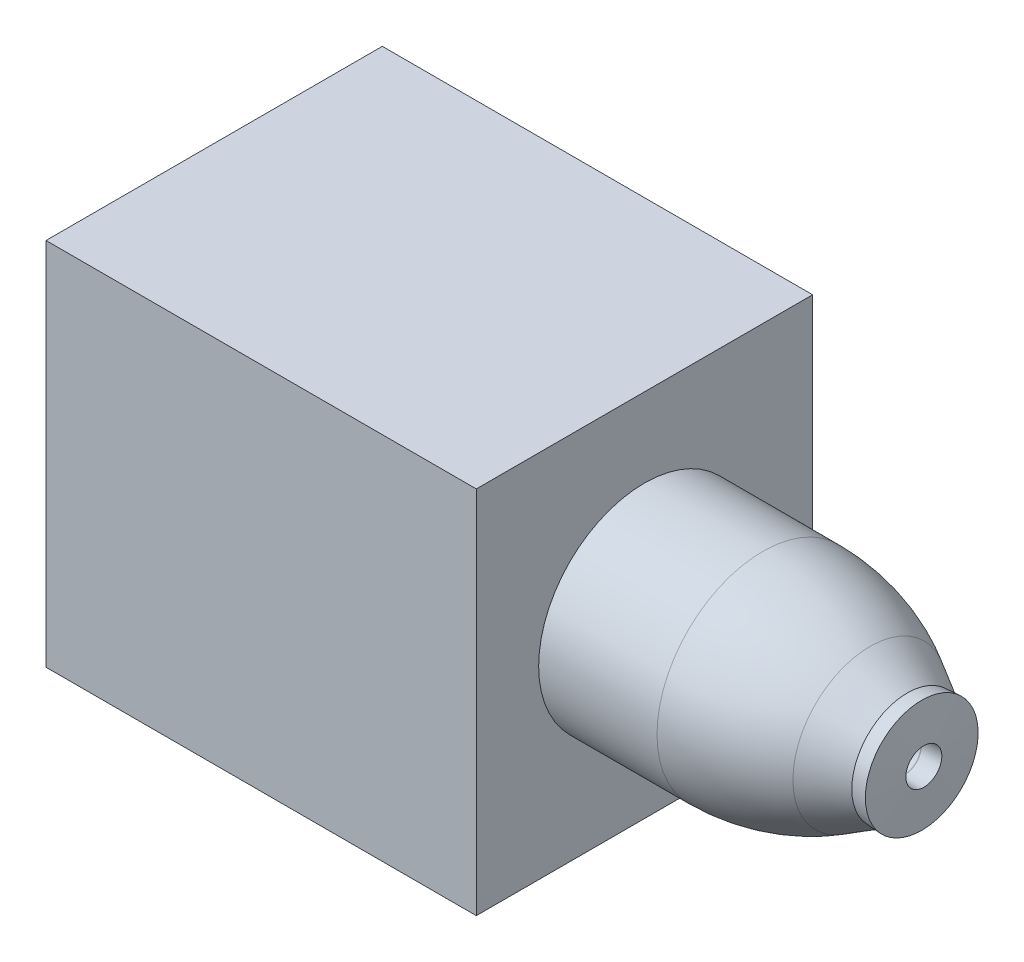
ISO-10303-21;
HEADER;
FILE_DESCRIPTION(('STEP AP214'),'2;1');
FILE_NAME('part.step','',(''),(''),'','','');
FILE_SCHEMA(('AUTOMOTIVE_DESIGN { 1 0 10303 214 1 1 1 1 }'));
ENDSEC;
DATA;
#1=APPLICATION_CONTEXT('core data for automotive mechanical design processes');
#2=APPLICATION_PROTOCOL_DEFINITION('international standard','automotive_design',2000,#1);
#3=PRODUCT_CONTEXT('',#1,'mechanical');
#4=PRODUCT('Part','Part','',(#3));
#5=PRODUCT_RELATED_PRODUCT_CATEGORY('part','',(#4));
#6=PRODUCT_DEFINITION_FORMATION('','',#4);
#7=PRODUCT_DEFINITION_CONTEXT('part definition',#1,'design');
#8=PRODUCT_DEFINITION('design','',#6,#7);
#9=PRODUCT_DEFINITION_SHAPE('','',#8);
#10=(LENGTH_UNIT() NAMED_UNIT(*) SI_UNIT(.MILLI.,.METRE.));
#11=(NAMED_UNIT(*) PLANE_ANGLE_UNIT() SI_UNIT($,.RADIAN.));
#12=(NAMED_UNIT(*) SI_UNIT($,.STERADIAN.) SOLID_ANGLE_UNIT());
#13=UNCERTAINTY_MEASURE_WITH_UNIT(LENGTH_MEASURE(1.E-05),#10,'distance_accuracy_value','');
#14=(GEOMETRIC_REPRESENTATION_CONTEXT(3) GLOBAL_UNCERTAINTY_ASSIGNED_CONTEXT((#13)) GLOBAL_UNIT_ASSIGNED_CONTEXT((#10,
#11,#12)) REPRESENTATION_CONTEXT('',''));
#15=CARTESIAN_POINT('',(0.,0.,0.));
#16=DIRECTION('',(0.,0.,1.));
#17=DIRECTION('',(1.,0.,0.));
#18=AXIS2_PLACEMENT_3D('',#15,#16,#17);
#19=CARTESIAN_POINT('',(0.,0.,0.));
#20=DIRECTION('',(-1.,0.,0.));
#21=DIRECTION('',(0.,0.,1.));
#22=AXIS2_PLACEMENT_3D('',#19,#20,#21);
#23=CYLINDRICAL_SURFACE('',#22,5.593842);
#24=CARTESIAN_POINT('',(58.3117616000078,0.,0.));
#25=DIRECTION('',(-1.,0.,0.));
#26=DIRECTION('',(0.,0.,1.));
#27=AXIS2_PLACEMENT_3D('',#24,#25,#26);
#28=CIRCLE('',#27,5.593842);
#29=CARTESIAN_POINT('',(58.3117616000078,0.,5.593842));
#30=VERTEX_POINT('',#29);
#31=EDGE_CURVE('E179',#30,#30,#28,.T.);
#32=ORIENTED_EDGE('',*,*,#31,.T.);
#33=EDGE_LOOP('',(#32));
#34=FACE_BOUND('',#33,.T.);
#35=CARTESIAN_POINT('',(52.0545881371469,0.,0.));
#36=DIRECTION('',(-1.,0.,0.));
#37=DIRECTION('',(0.,-1.,0.));
#38=AXIS2_PLACEMENT_3D('',#35,#36,#37);
#39=CIRCLE('',#38,5.593842);
#40=CARTESIAN_POINT('',(52.0545881371469,-5.593842,0.));
#41=VERTEX_POINT('',#40);
#42=EDGE_CURVE('E111',#41,#41,#39,.F.);
#43=ORIENTED_EDGE('',*,*,#42,.T.);
#44=EDGE_LOOP('',(#43));
#45=FACE_BOUND('',#44,.T.);
#46=ADVANCED_FACE('F43',(#34,#45),#23,.T.);
#47=CARTESIAN_POINT('',(0.,0.,0.));
#48=DIRECTION('',(-1.,0.,0.));
#49=DIRECTION('',(0.,0.,1.));
#50=AXIS2_PLACEMENT_3D('',#47,#48,#49);
#51=CYLINDRICAL_SURFACE('',#50,3.561842);
#52=CARTESIAN_POINT('',(58.3117616000078,0.,0.));
#53=DIRECTION('',(-1.,0.,0.));
#54=DIRECTION('',(0.,0.,1.));
#55=AXIS2_PLACEMENT_3D('',#52,#53,#54);
#56=CIRCLE('',#55,3.561842);
#57=CARTESIAN_POINT('',(58.3117616000078,0.,3.561842));
#58=VERTEX_POINT('',#57);
#59=EDGE_CURVE('E184',#58,#58,#56,.T.);
#60=ORIENTED_EDGE('',*,*,#59,.F.);
#61=EDGE_LOOP('',(#60));
#62=FACE_BOUND('',#61,.T.);
#63=CARTESIAN_POINT('',(52.0545881371469,0.,0.));
#64=DIRECTION('',(-1.,0.,0.));
#65=DIRECTION('',(0.,-1.,0.));
#66=AXIS2_PLACEMENT_3D('',#63,#64,#65);
#67=CIRCLE('',#66,3.561842);
#68=CARTESIAN_POINT('',(52.0545881371469,-3.561842,0.));
#69=VERTEX_POINT('',#68);
#70=EDGE_CURVE('E11',#69,#69,#67,.F.);
#71=ORIENTED_EDGE('',*,*,#70,.F.);
#72=EDGE_LOOP('',(#71));
#73=FACE_BOUND('',#72,.T.);
#74=ADVANCED_FACE('F155',(#62,#73),#51,.F.);
#75=CARTESIAN_POINT('',(65.9532683038968,2.9353891097983,0.));
#76=CARTESIAN_POINT('',(66.6139709220751,2.97512210961221,0.));
#77=CARTESIAN_POINT('',(66.7143441019035,2.98058093281139,0.));
#78=B_SPLINE_CURVE_WITH_KNOTS('',2,(#75,#76,#77),.UNSPECIFIED.,.F.,.F.,(3,3),(0.156174427909906,
1.),.UNSPECIFIED.);
#79=CARTESIAN_POINT('',(0.,0.,0.));
#80=DIRECTION('',(-1.,0.,0.));
#81=AXIS1_PLACEMENT('',#79,#80);
#82=SURFACE_OF_REVOLUTION('',#78,#81);
#83=CARTESIAN_POINT('',(66.7143441019035,0.,0.));
#84=DIRECTION('',(-1.,0.,0.));
#85=DIRECTION('',(0.,0.,1.));
#86=AXIS2_PLACEMENT_3D('',#83,#84,#85);
#87=CIRCLE('',#86,2.98058093281139);
#88=CARTESIAN_POINT('',(66.7143441019035,0.,2.98058093281126));
#89=VERTEX_POINT('',#88);
#90=EDGE_CURVE('E114',#89,#89,#87,.T.);
#91=ORIENTED_EDGE('',*,*,#90,.T.);
#92=EDGE_LOOP('',(#91));
#93=FACE_BOUND('',#92,.T.);
#94=CARTESIAN_POINT('',(65.9532683038983,0.,0.));
#95=DIRECTION('',(-1.,0.,0.));
#96=DIRECTION('',(0.,0.,1.));
#97=AXIS2_PLACEMENT_3D('',#94,#95,#96);
#98=CIRCLE('',#97,2.93538910979839);
#99=CARTESIAN_POINT('',(65.9532683038983,0.,2.93538910979839));
#100=VERTEX_POINT('',#99);
#101=EDGE_CURVE('E53',#100,#100,#98,.T.);
#102=ORIENTED_EDGE('',*,*,#101,.F.);
#103=EDGE_LOOP('',(#102));
#104=FACE_BOUND('',#103,.T.);
#105=ADVANCED_FACE('F45',(#93,#104),#82,.F.);
#106=CARTESIAN_POINT('',(63.9786225193763,0.,0.));
#107=DIRECTION('',(-1.,0.,0.));
#108=DIRECTION('',(0.,0.,1.));
#109=AXIS2_PLACEMENT_3D('',#106,#107,#108);
#110=CONICAL_SURFACE('',#109,4.07543272102918,0.523591686696446);
#111=ORIENTED_EDGE('',*,*,#101,.T.);
#112=EDGE_LOOP('',(#111));
#113=FACE_BOUND('',#112,.T.);
#114=CARTESIAN_POINT('',(63.9786225193763,0.,0.));
#115=DIRECTION('',(-1.,0.,0.));
#116=DIRECTION('',(0.,0.,1.));
#117=AXIS2_PLACEMENT_3D('',#114,#115,#116);
#118=CIRCLE('',#117,4.07543272102918);
#119=CARTESIAN_POINT('',(63.9786225193763,0.,4.07543272102918));
#120=VERTEX_POINT('',#119);
#121=EDGE_CURVE('E176',#120,#120,#118,.T.);
#122=ORIENTED_EDGE('',*,*,#121,.F.);
#123=EDGE_LOOP('',(#122));
#124=FACE_BOUND('',#123,.T.);
#125=ADVANCED_FACE('F163',(#113,#124),#110,.T.);
#126=CARTESIAN_POINT('',(58.3117616000078,0.,0.));
#127=DIRECTION('',(-1.,0.,0.));
#128=DIRECTION('',(0.,0.,1.));
#129=AXIS2_PLACEMENT_3D('',#126,#127,#128);
#130=DEGENERATE_TOROIDAL_SURFACE('',#129,5.740019,11.333861,.F.);
#131=ORIENTED_EDGE('',*,*,#31,.F.);
#132=EDGE_LOOP('',(#131));
#133=FACE_BOUND('',#132,.T.);
#134=ORIENTED_EDGE('',*,*,#121,.T.);
#135=EDGE_LOOP('',(#134));
#136=FACE_BOUND('',#135,.T.);
#137=ADVANCED_FACE('F153',(#133,#136),#130,.F.);
#138=CARTESIAN_POINT('',(58.3117616000078,0.,0.));
#139=DIRECTION('',(-1.,0.,0.));
#140=DIRECTION('',(0.,0.,1.));
#141=AXIS2_PLACEMENT_3D('',#138,#139,#140);
#142=DEGENERATE_TOROIDAL_SURFACE('',#141,5.740019,9.301861,.F.);
#143=ORIENTED_EDGE('',*,*,#59,.T.);
#144=EDGE_LOOP('',(#143));
#145=FACE_BOUND('',#144,.T.);
#146=CARTESIAN_POINT('',(62.9626349941934,0.,0.));
#147=DIRECTION('',(-1.,0.,0.));
#148=DIRECTION('',(0.,0.,1.));
#149=AXIS2_PLACEMENT_3D('',#146,#147,#148);
#150=CIRCLE('',#149,2.31566189825915);
#151=CARTESIAN_POINT('',(62.9626349941934,0.,2.31566189825915));
#152=VERTEX_POINT('',#151);
#153=EDGE_CURVE('E190',#152,#152,#150,.T.);
#154=ORIENTED_EDGE('',*,*,#153,.F.);
#155=EDGE_LOOP('',(#154));
#156=FACE_BOUND('',#155,.T.);
#157=ADVANCED_FACE('F149',(#145,#156),#142,.T.);
#158=CARTESIAN_POINT('',(62.9626349941934,0.,0.));
#159=DIRECTION('',(-1.,0.,0.));
#160=DIRECTION('',(0.,0.,1.));
#161=AXIS2_PLACEMENT_3D('',#158,#159,#160);
#162=CONICAL_SURFACE('',#161,2.31566189825915,0.523591686696449);
#163=CARTESIAN_POINT('',(65.1212312002225,0.,0.));
#164=DIRECTION('',(-1.,0.,0.));
#165=DIRECTION('',(0.,0.,1.));
#166=AXIS2_PLACEMENT_3D('',#163,#164,#165);
#167=CIRCLE('',#166,1.06941620032186);
#168=CARTESIAN_POINT('',(65.1212312002225,0.,1.06941620032186));
#169=VERTEX_POINT('',#168);
#170=EDGE_CURVE('E194',#169,#169,#167,.T.);
#171=ORIENTED_EDGE('',*,*,#170,.F.);
#172=EDGE_LOOP('',(#171));
#173=FACE_BOUND('',#172,.T.);
#174=ORIENTED_EDGE('',*,*,#153,.T.);
#175=EDGE_LOOP('',(#174));
#176=FACE_BOUND('',#175,.T.);
#177=ADVANCED_FACE('F145',(#173,#176),#162,.F.);
#178=CARTESIAN_POINT('',(65.7891091184058,0.,0.));
#179=DIRECTION('',(-1.,0.,0.));
#180=DIRECTION('',(0.,0.,1.));
#181=AXIS2_PLACEMENT_3D('',#178,#179,#180);
#182=TOROIDAL_SURFACE('',#181,2.22613219952242,1.3356844);
#183=CARTESIAN_POINT('',(65.7890734,0.,0.));
#184=DIRECTION('',(-1.,0.,0.));
#185=DIRECTION('',(0.,0.,1.));
#186=AXIS2_PLACEMENT_3D('',#183,#184,#185);
#187=CIRCLE('',#186,0.890447800000003);
#188=CARTESIAN_POINT('',(65.7890734,0.,0.890447800000003));
#189=VERTEX_POINT('',#188);
#190=EDGE_CURVE('E198',#189,#189,#187,.T.);
#191=ORIENTED_EDGE('',*,*,#190,.F.);
#192=EDGE_LOOP('',(#191));
#193=FACE_BOUND('',#192,.T.);
#194=ORIENTED_EDGE('',*,*,#170,.T.);
#195=EDGE_LOOP('',(#194));
#196=FACE_BOUND('',#195,.T.);
#197=ADVANCED_FACE('F141',(#193,#196),#182,.T.);
#198=CARTESIAN_POINT('',(65.7890734,0.,0.));
#199=DIRECTION('',(-1.,0.,0.));
#200=DIRECTION('',(0.,0.,1.));
#201=AXIS2_PLACEMENT_3D('',#198,#199,#200);
#202=TOROIDAL_SURFACE('',#201,1.2306046,0.3401568);
#203=CARTESIAN_POINT('',(65.8095181765908,0.,0.));
#204=DIRECTION('',(-1.,0.,0.));
#205=DIRECTION('',(0.,0.,1.));
#206=AXIS2_PLACEMENT_3D('',#203,#204,#205);
#207=CIRCLE('',#206,0.8910627620825);
#208=CARTESIAN_POINT('',(65.8095181765908,0.,0.8910627620825));
#209=VERTEX_POINT('',#208);
#210=EDGE_CURVE('E202',#209,#209,#207,.T.);
#211=ORIENTED_EDGE('',*,*,#210,.F.);
#212=EDGE_LOOP('',(#211));
#213=FACE_BOUND('',#212,.T.);
#214=ORIENTED_EDGE('',*,*,#190,.T.);
#215=EDGE_LOOP('',(#214));
#216=FACE_BOUND('',#215,.T.);
#217=ADVANCED_FACE('F136',(#213,#216),#202,.T.);
#218=CARTESIAN_POINT('',(65.8095181765908,0.8910627620825,0.));
#219=CARTESIAN_POINT('',(66.723641,0.9461246,0.));
#220=CARTESIAN_POINT('',(66.8238694,0.9515348,0.));
#221=B_SPLINE_CURVE_WITH_KNOTS('',2,(#218,#219,#220),.UNSPECIFIED.,.F.,.F.,(3,3),(0.,1.),.UNSPECIFIED.);
#222=CARTESIAN_POINT('',(0.,0.,0.));
#223=DIRECTION('',(-1.,0.,0.));
#224=AXIS1_PLACEMENT('',#222,#223);
#225=SURFACE_OF_REVOLUTION('',#221,#224);
#226=CARTESIAN_POINT('',(66.8238694,0.,0.));
#227=DIRECTION('',(-1.,0.,0.));
#228=DIRECTION('',(0.,0.,1.));
#229=AXIS2_PLACEMENT_3D('',#226,#227,#228);
#230=CIRCLE('',#229,0.9515348);
#231=CARTESIAN_POINT('',(66.8238694,0.,0.951534799999875));
#232=VERTEX_POINT('',#231);
#233=EDGE_CURVE('E205',#232,#232,#230,.T.);
#234=ORIENTED_EDGE('',*,*,#233,.F.);
#235=EDGE_LOOP('',(#234));
#236=FACE_BOUND('',#235,.T.);
#237=ORIENTED_EDGE('',*,*,#210,.T.);
#238=EDGE_LOOP('',(#237));
#239=FACE_BOUND('',#238,.T.);
#240=ADVANCED_FACE('F131',(#236,#239),#225,.T.);
#241=CARTESIAN_POINT('',(66.7143441019035,0.,0.));
#242=DIRECTION('',(-1.,0.,0.));
#243=DIRECTION('',(0.,0.,1.));
#244=AXIS2_PLACEMENT_3D('',#241,#242,#243);
#245=CONICAL_SURFACE('',#244,2.98058093281139,1.51686994866316);
#246=CARTESIAN_POINT('',(66.8238694,0.,0.951534799999875));
#247=CARTESIAN_POINT('',(66.8227285114782,0.,0.972670697216661));
#248=CARTESIAN_POINT('',(66.8215876229563,0.,0.993806594433446));
#249=CARTESIAN_POINT('',(66.8193058459126,0.,1.03607838886702));
#250=CARTESIAN_POINT('',(66.8181649573908,0.,1.0572142860838));
#251=CARTESIAN_POINT('',(66.8158831803471,0.,1.09948608051737));
#252=CARTESIAN_POINT('',(66.8147422918253,0.,1.12062197773416));
#253=CARTESIAN_POINT('',(66.8124605147816,0.,1.16289377216773));
#254=CARTESIAN_POINT('',(66.8113196262598,0.,1.18402966938451));
#255=CARTESIAN_POINT('',(66.8090378492161,0.,1.22630146381808));
#256=CARTESIAN_POINT('',(66.8078969606943,0.,1.24743736103487));
#257=CARTESIAN_POINT('',(66.8056151836506,0.,1.28970915546844));
#258=CARTESIAN_POINT('',(66.8044742951287,0.,1.31084505268523));
#259=CARTESIAN_POINT('',(66.8021925180851,0.,1.3531168471188));
#260=CARTESIAN_POINT('',(66.8010516295632,0.,1.37425274433558));
#261=CARTESIAN_POINT('',(66.7987698525196,0.,1.41652453876915));
#262=CARTESIAN_POINT('',(66.7976289639977,0.,1.43766043598594));
#263=CARTESIAN_POINT('',(66.795347186954,0.,1.47993223041951));
#264=CARTESIAN_POINT('',(66.7942062984322,0.,1.50106812763629));
#265=CARTESIAN_POINT('',(66.7919245213885,0.,1.54333992206986));
#266=CARTESIAN_POINT('',(66.7907836328667,0.,1.56447581928665));
#267=CARTESIAN_POINT('',(66.788501855823,0.,1.60674761372022));
#268=CARTESIAN_POINT('',(66.7873609673011,0.,1.627883510937));
#269=CARTESIAN_POINT('',(66.7850791902575,0.,1.67015530537058));
#270=CARTESIAN_POINT('',(66.7839383017356,0.,1.69129120258736));
#271=CARTESIAN_POINT('',(66.781656524692,0.,1.73356299702093));
#272=CARTESIAN_POINT('',(66.7805156361701,0.,1.75469889423772));
#273=CARTESIAN_POINT('',(66.7782338591264,0.,1.79697068867129));
#274=CARTESIAN_POINT('',(66.7770929706046,0.,1.81810658588807));
#275=CARTESIAN_POINT('',(66.7748111935609,0.,1.86037838032164));
#276=CARTESIAN_POINT('',(66.7736703050391,0.,1.88151427753843));
#277=CARTESIAN_POINT('',(66.7713885279954,0.,1.923786071972));
#278=CARTESIAN_POINT('',(66.7702476394736,0.,1.94492196918878));
#279=CARTESIAN_POINT('',(66.7679658624299,0.,1.98719376362236));
#280=CARTESIAN_POINT('',(66.7668249739081,0.,2.00832966083914));
#281=CARTESIAN_POINT('',(66.7645431968644,0.,2.05060145527271));
#282=CARTESIAN_POINT('',(66.7634023083425,0.,2.0717373524895));
#283=CARTESIAN_POINT('',(66.7611205312989,0.,2.11400914692307));
#284=CARTESIAN_POINT('',(66.759979642777,0.,2.13514504413985));
#285=CARTESIAN_POINT('',(66.7576978657333,0.,2.17741683857342));
#286=CARTESIAN_POINT('',(66.7565569772115,0.,2.19855273579021));
#287=CARTESIAN_POINT('',(66.7542752001678,0.,2.24082453022378));
#288=CARTESIAN_POINT('',(66.753134311646,0.,2.26196042744056));
#289=CARTESIAN_POINT('',(66.7508525346023,0.,2.30423222187414));
#290=CARTESIAN_POINT('',(66.7497116460805,0.,2.32536811909092));
#291=CARTESIAN_POINT('',(66.7474298690368,0.,2.36763991352449));
#292=CARTESIAN_POINT('',(66.746288980515,0.,2.38877581074128));
#293=CARTESIAN_POINT('',(66.7440072034713,0.,2.43104760517485));
#294=CARTESIAN_POINT('',(66.7428663149494,0.,2.45218350239163));
#295=CARTESIAN_POINT('',(66.7405845379058,0.,2.4944552968252));
#296=CARTESIAN_POINT('',(66.7394436493839,0.,2.51559119404199));
#297=CARTESIAN_POINT('',(66.7371618723402,0.,2.55786298847556));
#298=CARTESIAN_POINT('',(66.7360209838184,0.,2.57899888569234));
#299=CARTESIAN_POINT('',(66.7337392067747,0.,2.62127068012591));
#300=CARTESIAN_POINT('',(66.7325983182529,0.,2.6424065773427));
#301=CARTESIAN_POINT('',(66.7303165412092,0.,2.68467837177627));
#302=CARTESIAN_POINT('',(66.7291756526874,0.,2.70581426899306));
#303=CARTESIAN_POINT('',(66.7268938756437,0.,2.74808606342663));
#304=CARTESIAN_POINT('',(66.7257529871219,0.,2.76922196064341));
#305=CARTESIAN_POINT('',(66.7234712100782,0.,2.81149375507698));
#306=CARTESIAN_POINT('',(66.7223303215563,0.,2.83262965229377));
#307=CARTESIAN_POINT('',(66.7200485445127,0.,2.87490144672734));
#308=CARTESIAN_POINT('',(66.7189076559908,0.,2.89603734394412));
#309=CARTESIAN_POINT('',(66.7166258789472,0.,2.93830913837769));
#310=CARTESIAN_POINT('',(66.7154849904253,0.,2.95944503559448));
#311=CARTESIAN_POINT('',(66.7143441019035,0.,2.98058093281126));
#312=B_SPLINE_CURVE_WITH_KNOTS('',3,(#246,#247,#248,#249,#250,#251,#252,#253,#254,#255,#256,
#257,#258,#259,#260,#261,#262,#263,#264,#265,#266,#267,#268,#269,#270,#271,#272,#273,#274,#275,
#276,#277,#278,#279,#280,#281,#282,#283,#284,#285,#286,#287,#288,#289,#290,#291,#292,#293,#294,
#295,#296,#297,#298,#299,#300,#301,#302,#303,#304,#305,#306,#307,#308,#309,#310,#311),
.UNSPECIFIED.,.F.,.F.,(4,2,2,2,2,2,2,2,2,2,2,2,2,2,2,2,2,2,2,2,2,2,2,2,2,2,2,2,2,2,2,2,4),(0.,
0.0634999999999996,0.127,0.190499999999999,0.253999999999999,0.317499999999999,
0.380999999999999,0.444499999999999,0.507999999999999,0.571499999999999,0.634999999999999,
0.698499999999999,0.761999999999998,0.825499999999998,0.888999999999998,0.952499999999998,1.016,
1.0795,1.143,1.2065,1.27,1.3335,1.397,1.4605,1.524,1.5875,1.651,1.7145,1.778,1.8415,1.905,
1.9685,2.032),.UNSPECIFIED.);
#313=EDGE_CURVE('BSEAM135',#232,#89,#312,.T.);
#314=ORIENTED_EDGE('',*,*,#233,.T.);
#315=ORIENTED_EDGE('',*,*,#90,.F.);
#316=ORIENTED_EDGE('',*,*,#313,.T.);
#317=ORIENTED_EDGE('',*,*,#313,.F.);
#318=EDGE_LOOP('',(#314,#316,#315,#317));
#319=FACE_BOUND('',#318,.T.);
#320=ADVANCED_FACE('F135',(#319),#245,.T.);
#321=CARTESIAN_POINT('',(52.0545881371469,0.,8.89));
#322=DIRECTION('',(-1.,0.,0.));
#323=DIRECTION('',(0.,-1.,0.));
#324=AXIS2_PLACEMENT_3D('',#321,#322,#323);
#325=PLANE('',#324);
#326=ORIENTED_EDGE('',*,*,#70,.T.);
#327=EDGE_LOOP('',(#326));
#328=FACE_BOUND('',#327,.T.);
#329=ADVANCED_FACE('F216',(#328),#325,.F.);
#330=CARTESIAN_POINT('',(0.,-9.77030736313696,8.89));
#331=DIRECTION('',(0.,1.,0.));
#332=DIRECTION('',(0.,0.,1.));
#333=AXIS2_PLACEMENT_3D('',#330,#331,#332);
#334=PLANE('',#333);
#335=DIRECTION('',(1.,0.,0.));
#336=VECTOR('',#335,1.);
#337=CARTESIAN_POINT('',(0.,-9.77030736313696,8.89));
#338=LINE('',#337,#336);
#339=CARTESIAN_POINT('',(29.304045921028,-9.77030736313696,8.89));
#340=VERTEX_POINT('',#339);
#341=CARTESIAN_POINT('',(52.0545881371469,-9.77030736313696,8.89));
#342=VERTEX_POINT('',#341);
#343=EDGE_CURVE('E90',#340,#342,#338,.T.);
#344=ORIENTED_EDGE('',*,*,#343,.F.);
#345=DIRECTION('',(0.,0.,1.));
#346=VECTOR('',#345,1.);
#347=CARTESIAN_POINT('',(29.304045921028,-9.77030736313696,-8.89));
#348=LINE('',#347,#346);
#349=CARTESIAN_POINT('',(29.304045921028,-9.77030736313696,-8.89));
#350=VERTEX_POINT('',#349);
#351=EDGE_CURVE('E254',#350,#340,#348,.T.);
#352=ORIENTED_EDGE('',*,*,#351,.F.);
#353=DIRECTION('',(1.,0.,0.));
#354=VECTOR('',#353,1.);
#355=CARTESIAN_POINT('',(0.,-9.77030736313696,-8.89));
#356=LINE('',#355,#354);
#357=CARTESIAN_POINT('',(52.0545881371469,-9.77030736313696,-8.89));
#358=VERTEX_POINT('',#357);
#359=EDGE_CURVE('E103',#350,#358,#356,.T.);
#360=ORIENTED_EDGE('',*,*,#359,.T.);
#361=DIRECTION('',(0.,0.,-1.));
#362=VECTOR('',#361,1.);
#363=CARTESIAN_POINT('',(52.0545881371469,-9.77030736313696,8.89));
#364=LINE('',#363,#362);
#365=EDGE_CURVE('E98',#342,#358,#364,.T.);
#366=ORIENTED_EDGE('',*,*,#365,.F.);
#367=EDGE_LOOP('',(#344,#352,#360,#366));
#368=FACE_BOUND('',#367,.T.);
#369=ADVANCED_FACE('F220',(#368),#334,.F.);
#370=ORIENTED_EDGE('',*,*,#42,.F.);
#371=EDGE_LOOP('',(#370));
#372=FACE_BOUND('',#371,.T.);
#373=DIRECTION('',(0.,1.,0.));
#374=VECTOR('',#373,1.);
#375=CARTESIAN_POINT('',(52.0545881371469,0.,-8.89));
#376=LINE('',#375,#374);
#377=CARTESIAN_POINT('',(52.0545881371468,9.77030736313698,-8.89));
#378=VERTEX_POINT('',#377);
#379=EDGE_CURVE('E86',#358,#378,#376,.T.);
#380=ORIENTED_EDGE('',*,*,#379,.T.);
#381=DIRECTION('',(0.,0.,-1.));
#382=VECTOR('',#381,1.);
#383=CARTESIAN_POINT('',(52.0545881371468,9.77030736313698,8.89));
#384=LINE('',#383,#382);
#385=CARTESIAN_POINT('',(52.0545881371468,9.77030736313698,8.89));
#386=VERTEX_POINT('',#385);
#387=EDGE_CURVE('E93',#386,#378,#384,.T.);
#388=ORIENTED_EDGE('',*,*,#387,.F.);
#389=DIRECTION('',(0.,1.,0.));
#390=VECTOR('',#389,1.);
#391=CARTESIAN_POINT('',(52.0545881371469,0.,8.89));
#392=LINE('',#391,#390);
#393=EDGE_CURVE('E260',#342,#386,#392,.T.);
#394=ORIENTED_EDGE('',*,*,#393,.F.);
#395=ORIENTED_EDGE('',*,*,#365,.T.);
#396=EDGE_LOOP('',(#380,#388,#394,#395));
#397=FACE_BOUND('',#396,.T.);
#398=ADVANCED_FACE('F100',(#372,#397),#325,.F.);
#399=CARTESIAN_POINT('',(0.,9.77030736313696,8.89));
#400=DIRECTION('',(0.,1.,0.));
#401=DIRECTION('',(-1.,0.,0.));
#402=AXIS2_PLACEMENT_3D('',#399,#400,#401);
#403=PLANE('',#402);
#404=DIRECTION('',(0.,0.,1.));
#405=VECTOR('',#404,1.);
#406=CARTESIAN_POINT('',(29.304045921028,9.77030736313697,-8.89));
#407=LINE('',#406,#405);
#408=CARTESIAN_POINT('',(29.304045921028,9.77030736313697,-8.89));
#409=VERTEX_POINT('',#408);
#410=CARTESIAN_POINT('',(29.304045921028,9.77030736313697,8.89));
#411=VERTEX_POINT('',#410);
#412=EDGE_CURVE('E60',#409,#411,#407,.T.);
#413=ORIENTED_EDGE('',*,*,#412,.T.);
#414=DIRECTION('',(1.,0.,0.));
#415=VECTOR('',#414,1.);
#416=CARTESIAN_POINT('',(0.,9.77030736313696,8.89));
#417=LINE('',#416,#415);
#418=EDGE_CURVE('E68',#411,#386,#417,.T.);
#419=ORIENTED_EDGE('',*,*,#418,.T.);
#420=ORIENTED_EDGE('',*,*,#387,.T.);
#421=DIRECTION('',(1.,0.,0.));
#422=VECTOR('',#421,1.);
#423=CARTESIAN_POINT('',(0.,9.77030736313696,-8.89));
#424=LINE('',#423,#422);
#425=EDGE_CURVE('E82',#409,#378,#424,.T.);
#426=ORIENTED_EDGE('',*,*,#425,.F.);
#427=EDGE_LOOP('',(#413,#419,#420,#426));
#428=FACE_BOUND('',#427,.T.);
#429=ADVANCED_FACE('F94',(#428),#403,.T.);
#430=CARTESIAN_POINT('',(0.,0.,8.89));
#431=DIRECTION('',(0.,0.,1.));
#432=DIRECTION('',(1.,0.,0.));
#433=AXIS2_PLACEMENT_3D('',#430,#431,#432);
#434=PLANE('',#433);
#435=DIRECTION('',(0.,1.,0.));
#436=VECTOR('',#435,1.);
#437=CARTESIAN_POINT('',(29.304045921028,-9.77030736313696,8.89));
#438=LINE('',#437,#436);
#439=EDGE_CURVE('E251',#340,#411,#438,.T.);
#440=ORIENTED_EDGE('',*,*,#439,.F.);
#441=ORIENTED_EDGE('',*,*,#343,.T.);
#442=ORIENTED_EDGE('',*,*,#393,.T.);
#443=ORIENTED_EDGE('',*,*,#418,.F.);
#444=EDGE_LOOP('',(#440,#441,#442,#443));
#445=FACE_BOUND('',#444,.T.);
#446=ADVANCED_FACE('F233',(#445),#434,.T.);
#447=CARTESIAN_POINT('',(0.,0.,-8.89));
#448=DIRECTION('',(0.,0.,1.));
#449=DIRECTION('',(1.,0.,0.));
#450=AXIS2_PLACEMENT_3D('',#447,#448,#449);
#451=PLANE('',#450);
#452=ORIENTED_EDGE('',*,*,#359,.F.);
#453=DIRECTION('',(0.,1.,0.));
#454=VECTOR('',#453,1.);
#455=CARTESIAN_POINT('',(29.304045921028,-9.77030736313696,-8.89));
#456=LINE('',#455,#454);
#457=EDGE_CURVE('E88',#350,#409,#456,.T.);
#458=ORIENTED_EDGE('',*,*,#457,.T.);
#459=ORIENTED_EDGE('',*,*,#425,.T.);
#460=ORIENTED_EDGE('',*,*,#379,.F.);
#461=EDGE_LOOP('',(#452,#458,#459,#460));
#462=FACE_BOUND('',#461,.T.);
#463=ADVANCED_FACE('F84',(#462),#451,.F.);
#464=CARTESIAN_POINT('',(29.304045921028,-9.77030736313696,-8.89));
#465=DIRECTION('',(1.,0.,0.));
#466=DIRECTION('',(0.,0.,-1.));
#467=AXIS2_PLACEMENT_3D('',#464,#465,#466);
#468=PLANE('',#467);
#469=ORIENTED_EDGE('',*,*,#439,.T.);
#470=ORIENTED_EDGE('',*,*,#412,.F.);
#471=ORIENTED_EDGE('',*,*,#457,.F.);
#472=ORIENTED_EDGE('',*,*,#351,.T.);
#473=EDGE_LOOP('',(#469,#470,#471,#472));
#474=FACE_BOUND('',#473,.T.);
#475=ADVANCED_FACE('F243',(#474),#468,.F.);
#476=CLOSED_SHELL('',(#46,#74,#105,#125,#137,#157,#177,#197,#217,#240,#320,#329,#369,#398,#429,
#446,#463,#475));
#477=MANIFOLD_SOLID_BREP('B2',#476);
#478=ADVANCED_BREP_SHAPE_REPRESENTATION('',(#18,#477),#14);
#479=SHAPE_DEFINITION_REPRESENTATION(#9,#478);
ENDSEC;
END-ISO-10303-21;
